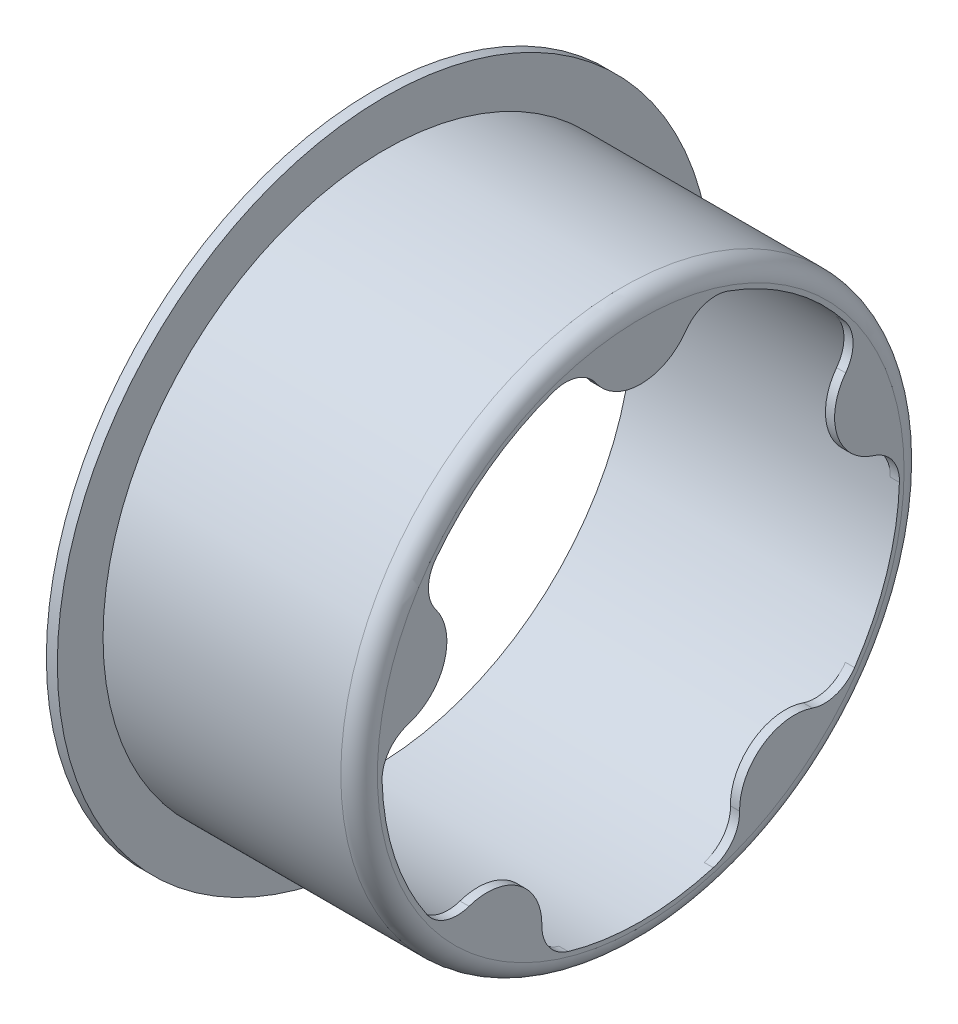
ISO-10303-21;
HEADER;
FILE_DESCRIPTION(('STEP AP214'),'2;1');
FILE_NAME('part.step','',(''),(''),'','','');
FILE_SCHEMA(('AUTOMOTIVE_DESIGN { 1 0 10303 214 1 1 1 1 }'));
ENDSEC;
DATA;
#1=APPLICATION_CONTEXT('core data for automotive mechanical design processes');
#2=APPLICATION_PROTOCOL_DEFINITION('international standard','automotive_design',2000,#1);
#3=PRODUCT_CONTEXT('',#1,'mechanical');
#4=PRODUCT('Part','Part','',(#3));
#5=PRODUCT_RELATED_PRODUCT_CATEGORY('part','',(#4));
#6=PRODUCT_DEFINITION_FORMATION('','',#4);
#7=PRODUCT_DEFINITION_CONTEXT('part definition',#1,'design');
#8=PRODUCT_DEFINITION('design','',#6,#7);
#9=PRODUCT_DEFINITION_SHAPE('','',#8);
#10=(LENGTH_UNIT() NAMED_UNIT(*) SI_UNIT(.MILLI.,.METRE.));
#11=(NAMED_UNIT(*) PLANE_ANGLE_UNIT() SI_UNIT($,.RADIAN.));
#12=(NAMED_UNIT(*) SI_UNIT($,.STERADIAN.) SOLID_ANGLE_UNIT());
#13=UNCERTAINTY_MEASURE_WITH_UNIT(LENGTH_MEASURE(1.E-05),#10,'distance_accuracy_value','');
#14=(GEOMETRIC_REPRESENTATION_CONTEXT(3) GLOBAL_UNCERTAINTY_ASSIGNED_CONTEXT((#13)) GLOBAL_UNIT_ASSIGNED_CONTEXT((#10,
#11,#12)) REPRESENTATION_CONTEXT('',''));
#15=CARTESIAN_POINT('',(0.,0.,0.));
#16=DIRECTION('',(0.,0.,1.));
#17=DIRECTION('',(1.,0.,0.));
#18=AXIS2_PLACEMENT_3D('',#15,#16,#17);
#19=CARTESIAN_POINT('',(-68.5530574043261,0.,0.));
#20=DIRECTION('',(-1.,0.,0.));
#21=DIRECTION('',(0.,0.,1.));
#22=AXIS2_PLACEMENT_3D('',#19,#20,#21);
#23=CYLINDRICAL_SURFACE('',#22,14.15);
#24=CARTESIAN_POINT('',(6.50000000000001,0.,0.));
#25=DIRECTION('',(1.,0.,0.));
#26=DIRECTION('',(0.,0.,-1.));
#27=AXIS2_PLACEMENT_3D('',#24,#25,#26);
#28=CIRCLE('',#27,14.15);
#29=CARTESIAN_POINT('',(6.50000000000001,8.65684248346348,-11.1929253645551));
#30=VERTEX_POINT('',#29);
#31=CARTESIAN_POINT('',(6.50000000000001,-0.424496227453108,-14.1436311798943));
#32=VERTEX_POINT('',#31);
#33=EDGE_CURVE('E376',#30,#32,#28,.F.);
#34=ORIENTED_EDGE('',*,*,#33,.F.);
#35=DIRECTION('',(-1.,0.,0.));
#36=VECTOR('',#35,1.);
#37=CARTESIAN_POINT('',(-68.5530574043261,8.65684248346348,-11.1929253645551));
#38=LINE('',#37,#36);
#39=CARTESIAN_POINT('',(7.00000000000001,8.65684248346348,-11.1929253645551));
#40=VERTEX_POINT('',#39);
#41=EDGE_CURVE('E222',#30,#40,#38,.F.);
#42=ORIENTED_EDGE('',*,*,#41,.T.);
#43=CARTESIAN_POINT('',(7.00000000000001,0.,0.));
#44=DIRECTION('',(1.,0.,0.));
#45=DIRECTION('',(0.,0.,-1.));
#46=AXIS2_PLACEMENT_3D('',#43,#44,#45);
#47=CIRCLE('',#46,14.15);
#48=CARTESIAN_POINT('',(7.00000000000001,13.3202160493827,-4.77434230002072));
#49=VERTEX_POINT('',#48);
#50=EDGE_CURVE('E195',#49,#40,#47,.F.);
#51=ORIENTED_EDGE('',*,*,#50,.F.);
#52=DIRECTION('',(-1.,0.,0.));
#53=VECTOR('',#52,1.);
#54=CARTESIAN_POINT('',(-68.5530574043261,13.3202160493827,-4.77434230002072));
#55=LINE('',#54,#53);
#56=CARTESIAN_POINT('',(6.50000000000001,13.3202160493827,-4.77434230002072));
#57=VERTEX_POINT('',#56);
#58=EDGE_CURVE('E199',#49,#57,#55,.T.);
#59=ORIENTED_EDGE('',*,*,#58,.T.);
#60=CARTESIAN_POINT('',(6.50000000000001,0.,0.));
#61=DIRECTION('',(1.,0.,0.));
#62=DIRECTION('',(0.,0.,-1.));
#63=AXIS2_PLACEMENT_3D('',#60,#61,#62);
#64=CIRCLE('',#63,14.15);
#65=CARTESIAN_POINT('',(6.50000000000001,13.3202160493827,4.77434230002072));
#66=VERTEX_POINT('',#65);
#67=EDGE_CURVE('E374',#66,#57,#64,.F.);
#68=ORIENTED_EDGE('',*,*,#67,.F.);
#69=DIRECTION('',(-1.,0.,0.));
#70=VECTOR('',#69,1.);
#71=CARTESIAN_POINT('',(-68.5530574043261,13.3202160493827,4.77434230002072));
#72=LINE('',#71,#70);
#73=CARTESIAN_POINT('',(7.00000000000001,13.3202160493827,4.77434230002072));
#74=VERTEX_POINT('',#73);
#75=EDGE_CURVE('E191',#66,#74,#72,.F.);
#76=ORIENTED_EDGE('',*,*,#75,.T.);
#77=CARTESIAN_POINT('',(7.00000000000001,8.65684248346347,11.1929253645551));
#78=VERTEX_POINT('',#77);
#79=EDGE_CURVE('E177',#78,#74,#47,.F.);
#80=ORIENTED_EDGE('',*,*,#79,.F.);
#81=DIRECTION('',(-1.,0.,0.));
#82=VECTOR('',#81,1.);
#83=CARTESIAN_POINT('',(-68.5530574043261,8.65684248346348,11.1929253645551));
#84=LINE('',#83,#82);
#85=CARTESIAN_POINT('',(6.50000000000001,8.65684248346347,11.1929253645551));
#86=VERTEX_POINT('',#85);
#87=EDGE_CURVE('E189',#78,#86,#84,.T.);
#88=ORIENTED_EDGE('',*,*,#87,.T.);
#89=CARTESIAN_POINT('',(6.50000000000001,0.,0.));
#90=DIRECTION('',(1.,0.,0.));
#91=DIRECTION('',(0.,0.,-1.));
#92=AXIS2_PLACEMENT_3D('',#89,#90,#91);
#93=CIRCLE('',#92,14.15);
#94=CARTESIAN_POINT('',(6.50000000000001,-0.424496227453111,14.1436311798943));
#95=VERTEX_POINT('',#94);
#96=EDGE_CURVE('E382',#95,#86,#93,.F.);
#97=ORIENTED_EDGE('',*,*,#96,.F.);
#98=DIRECTION('',(-1.,0.,0.));
#99=VECTOR('',#98,1.);
#100=CARTESIAN_POINT('',(-68.5530574043261,-0.424496227453111,14.1436311798943));
#101=LINE('',#100,#99);
#102=CARTESIAN_POINT('',(7.00000000000001,-0.424496227453111,14.1436311798943));
#103=VERTEX_POINT('',#102);
#104=EDGE_CURVE('E198',#95,#103,#101,.F.);
#105=ORIENTED_EDGE('',*,*,#104,.T.);
#106=CARTESIAN_POINT('',(7.00000000000001,-7.96999315934824,11.6919506088566));
#107=VERTEX_POINT('',#106);
#108=EDGE_CURVE('E192',#107,#103,#47,.F.);
#109=ORIENTED_EDGE('',*,*,#108,.F.);
#110=DIRECTION('',(-1.,0.,0.));
#111=VECTOR('',#110,1.);
#112=CARTESIAN_POINT('',(-68.5530574043261,-7.96999315934824,11.6919506088566));
#113=LINE('',#112,#111);
#114=CARTESIAN_POINT('',(6.50000000000001,-7.96999315934824,11.6919506088566));
#115=VERTEX_POINT('',#114);
#116=EDGE_CURVE('E210',#107,#115,#113,.T.);
#117=ORIENTED_EDGE('',*,*,#116,.T.);
#118=CARTESIAN_POINT('',(6.50000000000001,0.,0.));
#119=DIRECTION('',(1.,0.,0.));
#120=DIRECTION('',(0.,0.,-1.));
#121=AXIS2_PLACEMENT_3D('',#118,#119,#120);
#122=CIRCLE('',#121,14.15);
#123=CARTESIAN_POINT('',(6.50000000000001,-13.5825691460448,3.96690249349674));
#124=VERTEX_POINT('',#123);
#125=EDGE_CURVE('E380',#124,#115,#122,.F.);
#126=ORIENTED_EDGE('',*,*,#125,.F.);
#127=DIRECTION('',(-1.,0.,0.));
#128=VECTOR('',#127,1.);
#129=CARTESIAN_POINT('',(-68.5530574043261,-13.5825691460448,3.96690249349674));
#130=LINE('',#129,#128);
#131=CARTESIAN_POINT('',(7.00000000000001,-13.5825691460448,3.96690249349674));
#132=VERTEX_POINT('',#131);
#133=EDGE_CURVE('E202',#124,#132,#130,.F.);
#134=ORIENTED_EDGE('',*,*,#133,.T.);
#135=CARTESIAN_POINT('',(7.00000000000001,-13.5825691460448,-3.96690249349674));
#136=VERTEX_POINT('',#135);
#137=EDGE_CURVE('E369',#136,#132,#47,.F.);
#138=ORIENTED_EDGE('',*,*,#137,.F.);
#139=DIRECTION('',(-1.,0.,0.));
#140=VECTOR('',#139,1.);
#141=CARTESIAN_POINT('',(-68.5530574043261,-13.5825691460448,-3.96690249349674));
#142=LINE('',#141,#140);
#143=CARTESIAN_POINT('',(6.50000000000001,-13.5825691460448,-3.96690249349674));
#144=VERTEX_POINT('',#143);
#145=EDGE_CURVE('E213',#136,#144,#142,.T.);
#146=ORIENTED_EDGE('',*,*,#145,.T.);
#147=CARTESIAN_POINT('',(6.50000000000001,0.,0.));
#148=DIRECTION('',(1.,0.,0.));
#149=DIRECTION('',(0.,0.,-1.));
#150=AXIS2_PLACEMENT_3D('',#147,#148,#149);
#151=CIRCLE('',#150,14.15);
#152=CARTESIAN_POINT('',(6.50000000000001,-7.96999315934824,-11.6919506088566));
#153=VERTEX_POINT('',#152);
#154=EDGE_CURVE('E378',#153,#144,#151,.F.);
#155=ORIENTED_EDGE('',*,*,#154,.F.);
#156=DIRECTION('',(-1.,0.,0.));
#157=VECTOR('',#156,1.);
#158=CARTESIAN_POINT('',(-68.5530574043261,-7.96999315934824,-11.6919506088566));
#159=LINE('',#158,#157);
#160=CARTESIAN_POINT('',(7.00000000000001,-7.96999315934824,-11.6919506088566));
#161=VERTEX_POINT('',#160);
#162=EDGE_CURVE('E216',#153,#161,#159,.F.);
#163=ORIENTED_EDGE('',*,*,#162,.T.);
#164=CARTESIAN_POINT('',(7.00000000000001,-0.424496227453108,-14.1436311798943));
#165=VERTEX_POINT('',#164);
#166=EDGE_CURVE('E364',#165,#161,#47,.F.);
#167=ORIENTED_EDGE('',*,*,#166,.F.);
#168=DIRECTION('',(-1.,0.,0.));
#169=VECTOR('',#168,1.);
#170=CARTESIAN_POINT('',(-68.5530574043261,-0.424496227453108,-14.1436311798943));
#171=LINE('',#170,#169);
#172=EDGE_CURVE('E219',#165,#32,#171,.T.);
#173=ORIENTED_EDGE('',*,*,#172,.T.);
#174=EDGE_LOOP('',(#34,#42,#51,#59,#68,#76,#80,#88,#97,#105,#109,#117,#126,#134,#138,#146,#155,
#163,#167,#173));
#175=FACE_BOUND('',#174,.T.);
#176=CARTESIAN_POINT('',(-7.6,0.,0.));
#177=DIRECTION('',(-1.,0.,0.));
#178=DIRECTION('',(0.,0.,1.));
#179=AXIS2_PLACEMENT_3D('',#176,#177,#178);
#180=CIRCLE('',#179,14.15);
#181=CARTESIAN_POINT('',(-7.6,0.,14.15));
#182=VERTEX_POINT('',#181);
#183=EDGE_CURVE('E363',#182,#182,#180,.T.);
#184=ORIENTED_EDGE('',*,*,#183,.T.);
#185=EDGE_LOOP('',(#184));
#186=FACE_BOUND('',#185,.T.);
#187=ADVANCED_FACE('F34',(#175,#186),#23,.F.);
#188=CARTESIAN_POINT('',(-68.5530574043261,0.,0.));
#189=DIRECTION('',(-1.,0.,0.));
#190=DIRECTION('',(0.,0.,1.));
#191=AXIS2_PLACEMENT_3D('',#188,#189,#190);
#192=CYLINDRICAL_SURFACE('',#191,15.4);
#193=CARTESIAN_POINT('',(6.00000000000001,0.,0.));
#194=DIRECTION('',(1.,0.,0.));
#195=DIRECTION('',(0.,0.,-1.));
#196=AXIS2_PLACEMENT_3D('',#193,#194,#195);
#197=CIRCLE('',#196,15.4);
#198=CARTESIAN_POINT('',(6.00000000000001,0.,-15.4));
#199=VERTEX_POINT('',#198);
#200=EDGE_CURVE('E11',#199,#199,#197,.F.);
#201=ORIENTED_EDGE('',*,*,#200,.T.);
#202=EDGE_LOOP('',(#201));
#203=FACE_BOUND('',#202,.T.);
#204=CARTESIAN_POINT('',(-6.99999999999999,0.,0.));
#205=DIRECTION('',(-1.,0.,0.));
#206=DIRECTION('',(0.,0.,1.));
#207=AXIS2_PLACEMENT_3D('',#204,#205,#206);
#208=CIRCLE('',#207,15.4);
#209=CARTESIAN_POINT('',(-6.99999999999999,0.,15.4));
#210=VERTEX_POINT('',#209);
#211=EDGE_CURVE('E372',#210,#210,#208,.T.);
#212=ORIENTED_EDGE('',*,*,#211,.F.);
#213=EDGE_LOOP('',(#212));
#214=FACE_BOUND('',#213,.T.);
#215=ADVANCED_FACE('F298',(#203,#214),#192,.T.);
#216=CARTESIAN_POINT('',(-7.,0.,-17.9));
#217=DIRECTION('',(-1.,0.,0.));
#218=DIRECTION('',(0.,0.,1.));
#219=AXIS2_PLACEMENT_3D('',#216,#217,#218);
#220=PLANE('',#219);
#221=CARTESIAN_POINT('',(-6.99999999999999,0.,0.));
#222=DIRECTION('',(-1.,0.,0.));
#223=DIRECTION('',(0.,0.,1.));
#224=AXIS2_PLACEMENT_3D('',#221,#222,#223);
#225=CIRCLE('',#224,17.9);
#226=CARTESIAN_POINT('',(-6.99999999999999,0.,17.9));
#227=VERTEX_POINT('',#226);
#228=EDGE_CURVE('E429',#227,#227,#225,.T.);
#229=ORIENTED_EDGE('',*,*,#228,.F.);
#230=EDGE_LOOP('',(#229));
#231=FACE_BOUND('',#230,.T.);
#232=ORIENTED_EDGE('',*,*,#211,.T.);
#233=EDGE_LOOP('',(#232));
#234=FACE_BOUND('',#233,.T.);
#235=ADVANCED_FACE('F303',(#231,#234),#220,.F.);
#236=CARTESIAN_POINT('',(-68.5530574043261,0.,0.));
#237=DIRECTION('',(-1.,0.,0.));
#238=DIRECTION('',(0.,0.,1.));
#239=AXIS2_PLACEMENT_3D('',#236,#237,#238);
#240=CYLINDRICAL_SURFACE('',#239,17.9);
#241=CARTESIAN_POINT('',(-7.6,0.,0.));
#242=DIRECTION('',(-1.,0.,0.));
#243=DIRECTION('',(0.,0.,1.));
#244=AXIS2_PLACEMENT_3D('',#241,#242,#243);
#245=CIRCLE('',#244,17.9);
#246=CARTESIAN_POINT('',(-7.6,0.,17.9));
#247=VERTEX_POINT('',#246);
#248=EDGE_CURVE('E366',#247,#247,#245,.T.);
#249=ORIENTED_EDGE('',*,*,#248,.F.);
#250=EDGE_LOOP('',(#249));
#251=FACE_BOUND('',#250,.T.);
#252=ORIENTED_EDGE('',*,*,#228,.T.);
#253=EDGE_LOOP('',(#252));
#254=FACE_BOUND('',#253,.T.);
#255=ADVANCED_FACE('F312',(#251,#254),#240,.T.);
#256=CARTESIAN_POINT('',(-7.6,0.,-14.15));
#257=DIRECTION('',(1.,0.,0.));
#258=DIRECTION('',(0.,0.,-1.));
#259=AXIS2_PLACEMENT_3D('',#256,#257,#258);
#260=PLANE('',#259);
#261=ORIENTED_EDGE('',*,*,#183,.F.);
#262=EDGE_LOOP('',(#261));
#263=FACE_BOUND('',#262,.T.);
#264=ORIENTED_EDGE('',*,*,#248,.T.);
#265=EDGE_LOOP('',(#264));
#266=FACE_BOUND('',#265,.T.);
#267=ADVANCED_FACE('F309',(#263,#266),#260,.F.);
#268=CARTESIAN_POINT('',(7.00000000000001,0.,-17.9));
#269=DIRECTION('',(1.,0.,0.));
#270=DIRECTION('',(0.,0.,-1.));
#271=AXIS2_PLACEMENT_3D('',#268,#269,#270);
#272=PLANE('',#271);
#273=CARTESIAN_POINT('',(7.00000000000001,0.,0.));
#274=DIRECTION('',(1.,0.,0.));
#275=DIRECTION('',(0.,0.,-1.));
#276=AXIS2_PLACEMENT_3D('',#273,#274,#275);
#277=CIRCLE('',#276,14.4);
#278=CARTESIAN_POINT('',(7.00000000000001,0.,-14.4));
#279=VERTEX_POINT('',#278);
#280=EDGE_CURVE('E42',#279,#279,#277,.T.);
#281=ORIENTED_EDGE('',*,*,#280,.T.);
#282=EDGE_LOOP('',(#281));
#283=FACE_BOUND('',#282,.T.);
#284=CARTESIAN_POINT('',(7.00000000000001,-11.5689430195618,8.40532910778237));
#285=DIRECTION('',(1.,0.,0.));
#286=DIRECTION('',(0.,0.,-1.));
#287=AXIS2_PLACEMENT_3D('',#284,#285,#286);
#288=CIRCLE('',#287,3.);
#289=CARTESIAN_POINT('',(7.00000000000001,-11.6252400399566,5.40585738004519));
#290=VERTEX_POINT('',#289);
#291=CARTESIAN_POINT('',(7.00000000000001,-8.73367262348892,9.3857584938949));
#292=VERTEX_POINT('',#291);
#293=EDGE_CURVE('E421',#290,#292,#288,.T.);
#294=ORIENTED_EDGE('',*,*,#293,.T.);
#295=CARTESIAN_POINT('',(7.00000000000001,-6.84349235944036,10.0393780846366));
#296=DIRECTION('',(1.,0.,0.));
#297=DIRECTION('',(0.,0.,-1.));
#298=AXIS2_PLACEMENT_3D('',#295,#296,#297);
#299=CIRCLE('',#298,2.);
#300=EDGE_CURVE('E264',#292,#107,#299,.F.);
#301=ORIENTED_EDGE('',*,*,#300,.T.);
#302=ORIENTED_EDGE('',*,*,#108,.T.);
#303=CARTESIAN_POINT('',(7.00000000000001,-0.364496760675286,12.1445313664817));
#304=DIRECTION('',(1.,0.,0.));
#305=DIRECTION('',(0.,0.,-1.));
#306=AXIS2_PLACEMENT_3D('',#303,#304,#305);
#307=CIRCLE('',#306,2.);
#308=CARTESIAN_POINT('',(7.00000000000001,1.54887915141953,12.7267620930973));
#309=VERTEX_POINT('',#308);
#310=EDGE_CURVE('E271',#103,#309,#307,.F.);
#311=ORIENTED_EDGE('',*,*,#310,.T.);
#312=CARTESIAN_POINT('',(7.00000000000001,4.41894301956175,13.6001081830207));
#313=DIRECTION('',(1.,0.,0.));
#314=DIRECTION('',(0.,0.,-1.));
#315=AXIS2_PLACEMENT_3D('',#312,#313,#314);
#316=CIRCLE('',#315,3.);
#317=CARTESIAN_POINT('',(7.00000000000001,6.22753351202602,11.2065751394703));
#318=VERTEX_POINT('',#317);
#319=EDGE_CURVE('E179',#309,#318,#316,.T.);
#320=ORIENTED_EDGE('',*,*,#319,.T.);
#321=CARTESIAN_POINT('',(7.00000000000001,7.43326050700221,9.61088644376997));
#322=DIRECTION('',(1.,0.,0.));
#323=DIRECTION('',(0.,0.,-1.));
#324=AXIS2_PLACEMENT_3D('',#321,#322,#323);
#325=CIRCLE('',#324,2.);
#326=EDGE_CURVE('E173',#318,#78,#325,.F.);
#327=ORIENTED_EDGE('',*,*,#326,.T.);
#328=ORIENTED_EDGE('',*,*,#79,.T.);
#329=CARTESIAN_POINT('',(7.00000000000001,11.4375,4.09952360037115));
#330=DIRECTION('',(1.,0.,0.));
#331=DIRECTION('',(0.,0.,-1.));
#332=AXIS2_PLACEMENT_3D('',#329,#330,#331);
#333=CIRCLE('',#332,2.);
#334=CARTESIAN_POINT('',(7.00000000000001,12.5825,2.45971416022269));
#335=VERTEX_POINT('',#334);
#336=EDGE_CURVE('E280',#74,#335,#333,.F.);
#337=ORIENTED_EDGE('',*,*,#336,.T.);
#338=CARTESIAN_POINT('',(7.00000000000001,14.3,0.));
#339=DIRECTION('',(1.,0.,0.));
#340=DIRECTION('',(0.,0.,-1.));
#341=AXIS2_PLACEMENT_3D('',#338,#339,#340);
#342=CIRCLE('',#341,3.);
#343=CARTESIAN_POINT('',(7.00000000000001,12.5825,-2.45971416022269));
#344=VERTEX_POINT('',#343);
#345=EDGE_CURVE('E361',#335,#344,#342,.T.);
#346=ORIENTED_EDGE('',*,*,#345,.T.);
#347=CARTESIAN_POINT('',(7.00000000000001,11.4375,-4.09952360037115));
#348=DIRECTION('',(1.,0.,0.));
#349=DIRECTION('',(0.,0.,-1.));
#350=AXIS2_PLACEMENT_3D('',#347,#348,#349);
#351=CIRCLE('',#350,2.);
#352=EDGE_CURVE('E278',#344,#49,#351,.F.);
#353=ORIENTED_EDGE('',*,*,#352,.T.);
#354=ORIENTED_EDGE('',*,*,#50,.T.);
#355=CARTESIAN_POINT('',(7.00000000000001,7.43326050700221,-9.61088644376997));
#356=DIRECTION('',(1.,0.,0.));
#357=DIRECTION('',(0.,0.,-1.));
#358=AXIS2_PLACEMENT_3D('',#355,#356,#357);
#359=CIRCLE('',#358,2.);
#360=CARTESIAN_POINT('',(7.00000000000001,6.22753351202603,-11.2065751394703));
#361=VERTEX_POINT('',#360);
#362=EDGE_CURVE('E244',#40,#361,#359,.F.);
#363=ORIENTED_EDGE('',*,*,#362,.T.);
#364=CARTESIAN_POINT('',(7.00000000000001,4.41894301956175,-13.6001081830207));
#365=DIRECTION('',(1.,0.,0.));
#366=DIRECTION('',(0.,0.,-1.));
#367=AXIS2_PLACEMENT_3D('',#364,#365,#366);
#368=CIRCLE('',#367,3.);
#369=CARTESIAN_POINT('',(7.00000000000001,1.54887915141953,-12.7267620930973));
#370=VERTEX_POINT('',#369);
#371=EDGE_CURVE('E412',#361,#370,#368,.T.);
#372=ORIENTED_EDGE('',*,*,#371,.T.);
#373=CARTESIAN_POINT('',(7.00000000000001,-0.364496760675283,-12.1445313664817));
#374=DIRECTION('',(1.,0.,0.));
#375=DIRECTION('',(0.,0.,-1.));
#376=AXIS2_PLACEMENT_3D('',#373,#374,#375);
#377=CIRCLE('',#376,2.);
#378=EDGE_CURVE('E251',#370,#165,#377,.F.);
#379=ORIENTED_EDGE('',*,*,#378,.T.);
#380=ORIENTED_EDGE('',*,*,#166,.T.);
#381=CARTESIAN_POINT('',(7.00000000000001,-6.84349235944036,-10.0393780846366));
#382=DIRECTION('',(1.,0.,0.));
#383=DIRECTION('',(0.,0.,-1.));
#384=AXIS2_PLACEMENT_3D('',#381,#382,#383);
#385=CIRCLE('',#384,2.);
#386=CARTESIAN_POINT('',(7.00000000000001,-8.73367262348891,-9.3857584938949));
#387=VERTEX_POINT('',#386);
#388=EDGE_CURVE('E253',#161,#387,#385,.F.);
#389=ORIENTED_EDGE('',*,*,#388,.T.);
#390=CARTESIAN_POINT('',(7.00000000000001,-11.5689430195617,-8.40532910778237));
#391=DIRECTION('',(1.,0.,0.));
#392=DIRECTION('',(0.,0.,-1.));
#393=AXIS2_PLACEMENT_3D('',#390,#391,#392);
#394=CIRCLE('',#393,3.);
#395=CARTESIAN_POINT('',(7.00000000000001,-11.6252400399566,-5.40585738004519));
#396=VERTEX_POINT('',#395);
#397=EDGE_CURVE('E413',#387,#396,#394,.T.);
#398=ORIENTED_EDGE('',*,*,#397,.T.);
#399=CARTESIAN_POINT('',(7.00000000000001,-11.6627713868866,-3.40620956155374));
#400=DIRECTION('',(1.,0.,0.));
#401=DIRECTION('',(0.,0.,-1.));
#402=AXIS2_PLACEMENT_3D('',#399,#400,#401);
#403=CIRCLE('',#402,2.);
#404=EDGE_CURVE('E260',#396,#136,#403,.F.);
#405=ORIENTED_EDGE('',*,*,#404,.T.);
#406=ORIENTED_EDGE('',*,*,#137,.T.);
#407=CARTESIAN_POINT('',(7.00000000000001,-11.6627713868866,3.40620956155373));
#408=DIRECTION('',(1.,0.,0.));
#409=DIRECTION('',(0.,0.,-1.));
#410=AXIS2_PLACEMENT_3D('',#407,#408,#409);
#411=CIRCLE('',#410,2.);
#412=EDGE_CURVE('E266',#132,#290,#411,.F.);
#413=ORIENTED_EDGE('',*,*,#412,.T.);
#414=EDGE_LOOP('',(#294,#301,#302,#311,#320,#327,#328,#337,#346,#353,#354,#363,#372,#379,#380,
#389,#398,#405,#406,#413));
#415=FACE_BOUND('',#414,.T.);
#416=ADVANCED_FACE('F176',(#283,#415),#272,.T.);
#417=CARTESIAN_POINT('',(6.50000000000001,7.15,0.));
#418=DIRECTION('',(1.,0.,0.));
#419=DIRECTION('',(0.,0.,-1.));
#420=AXIS2_PLACEMENT_3D('',#417,#418,#419);
#421=PLANE('',#420);
#422=CARTESIAN_POINT('',(6.50000000000001,14.3,0.));
#423=DIRECTION('',(1.,0.,0.));
#424=DIRECTION('',(0.,0.,-1.));
#425=AXIS2_PLACEMENT_3D('',#422,#423,#424);
#426=CIRCLE('',#425,3.);
#427=CARTESIAN_POINT('',(6.50000000000001,12.5825,2.45971416022269));
#428=VERTEX_POINT('',#427);
#429=CARTESIAN_POINT('',(6.50000000000001,12.5825,-2.45971416022269));
#430=VERTEX_POINT('',#429);
#431=EDGE_CURVE('E193',#428,#430,#426,.T.);
#432=ORIENTED_EDGE('',*,*,#431,.F.);
#433=CARTESIAN_POINT('',(6.50000000000001,11.4375,4.09952360037115));
#434=DIRECTION('',(1.,0.,0.));
#435=DIRECTION('',(0.,0.,-1.));
#436=AXIS2_PLACEMENT_3D('',#433,#434,#435);
#437=CIRCLE('',#436,2.);
#438=EDGE_CURVE('E282',#428,#66,#437,.T.);
#439=ORIENTED_EDGE('',*,*,#438,.T.);
#440=ORIENTED_EDGE('',*,*,#67,.T.);
#441=CARTESIAN_POINT('',(6.50000000000001,11.4375,-4.09952360037115));
#442=DIRECTION('',(1.,0.,0.));
#443=DIRECTION('',(0.,0.,-1.));
#444=AXIS2_PLACEMENT_3D('',#441,#442,#443);
#445=CIRCLE('',#444,2.);
#446=EDGE_CURVE('E49',#57,#430,#445,.T.);
#447=ORIENTED_EDGE('',*,*,#446,.T.);
#448=EDGE_LOOP('',(#432,#439,#440,#447));
#449=FACE_BOUND('',#448,.T.);
#450=ADVANCED_FACE('F441',(#449),#421,.F.);
#451=CARTESIAN_POINT('',(6.50000000000001,14.3,0.));
#452=DIRECTION('',(1.,0.,0.));
#453=DIRECTION('',(0.,0.,-1.));
#454=AXIS2_PLACEMENT_3D('',#451,#452,#453);
#455=CYLINDRICAL_SURFACE('',#454,3.);
#456=ORIENTED_EDGE('',*,*,#431,.T.);
#457=DIRECTION('',(1.,0.,0.));
#458=VECTOR('',#457,1.);
#459=CARTESIAN_POINT('',(6.50000000000001,12.5825,-2.45971416022269));
#460=LINE('',#459,#458);
#461=EDGE_CURVE('E242',#430,#344,#460,.T.);
#462=ORIENTED_EDGE('',*,*,#461,.T.);
#463=ORIENTED_EDGE('',*,*,#345,.F.);
#464=DIRECTION('',(1.,0.,0.));
#465=VECTOR('',#464,1.);
#466=CARTESIAN_POINT('',(6.50000000000001,12.5825,2.45971416022269));
#467=LINE('',#466,#465);
#468=EDGE_CURVE('E56',#335,#428,#467,.F.);
#469=ORIENTED_EDGE('',*,*,#468,.T.);
#470=EDGE_LOOP('',(#456,#462,#463,#469));
#471=FACE_BOUND('',#470,.T.);
#472=ADVANCED_FACE('F439',(#471),#455,.T.);
#473=CARTESIAN_POINT('',(6.50000000000001,2.20947150978088,-6.80005409151035));
#474=DIRECTION('',(1.,0.,0.));
#475=DIRECTION('',(0.,0.,-1.));
#476=AXIS2_PLACEMENT_3D('',#473,#474,#475);
#477=PLANE('',#476);
#478=CARTESIAN_POINT('',(6.50000000000001,4.41894301956175,-13.6001081830207));
#479=DIRECTION('',(1.,0.,0.));
#480=DIRECTION('',(0.,0.,-1.));
#481=AXIS2_PLACEMENT_3D('',#478,#479,#480);
#482=CIRCLE('',#481,3.);
#483=CARTESIAN_POINT('',(6.50000000000001,6.22753351202603,-11.2065751394703));
#484=VERTEX_POINT('',#483);
#485=CARTESIAN_POINT('',(6.50000000000001,1.54887915141953,-12.7267620930973));
#486=VERTEX_POINT('',#485);
#487=EDGE_CURVE('E416',#484,#486,#482,.T.);
#488=ORIENTED_EDGE('',*,*,#487,.F.);
#489=CARTESIAN_POINT('',(6.50000000000001,7.43326050700221,-9.61088644376997));
#490=DIRECTION('',(1.,0.,0.));
#491=DIRECTION('',(0.,0.,-1.));
#492=AXIS2_PLACEMENT_3D('',#489,#490,#491);
#493=CIRCLE('',#492,2.);
#494=EDGE_CURVE('E246',#484,#30,#493,.T.);
#495=ORIENTED_EDGE('',*,*,#494,.T.);
#496=ORIENTED_EDGE('',*,*,#33,.T.);
#497=CARTESIAN_POINT('',(6.50000000000001,-0.364496760675283,-12.1445313664817));
#498=DIRECTION('',(1.,0.,0.));
#499=DIRECTION('',(0.,0.,-1.));
#500=AXIS2_PLACEMENT_3D('',#497,#498,#499);
#501=CIRCLE('',#500,2.);
#502=EDGE_CURVE('E249',#32,#486,#501,.T.);
#503=ORIENTED_EDGE('',*,*,#502,.T.);
#504=EDGE_LOOP('',(#488,#495,#496,#503));
#505=FACE_BOUND('',#504,.T.);
#506=ADVANCED_FACE('F448',(#505),#477,.F.);
#507=CARTESIAN_POINT('',(6.50000000000001,4.41894301956175,-13.6001081830207));
#508=DIRECTION('',(1.,0.,0.));
#509=DIRECTION('',(0.,0.,-1.));
#510=AXIS2_PLACEMENT_3D('',#507,#508,#509);
#511=CYLINDRICAL_SURFACE('',#510,3.);
#512=ORIENTED_EDGE('',*,*,#371,.F.);
#513=DIRECTION('',(1.,0.,0.));
#514=VECTOR('',#513,1.);
#515=CARTESIAN_POINT('',(6.50000000000001,6.22753351202603,-11.2065751394703));
#516=LINE('',#515,#514);
#517=EDGE_CURVE('E227',#361,#484,#516,.F.);
#518=ORIENTED_EDGE('',*,*,#517,.T.);
#519=ORIENTED_EDGE('',*,*,#487,.T.);
#520=DIRECTION('',(1.,0.,0.));
#521=VECTOR('',#520,1.);
#522=CARTESIAN_POINT('',(6.50000000000001,1.54887915141953,-12.7267620930973));
#523=LINE('',#522,#521);
#524=EDGE_CURVE('E225',#486,#370,#523,.T.);
#525=ORIENTED_EDGE('',*,*,#524,.T.);
#526=EDGE_LOOP('',(#512,#518,#519,#525));
#527=FACE_BOUND('',#526,.T.);
#528=ADVANCED_FACE('F450',(#527),#511,.T.);
#529=CARTESIAN_POINT('',(6.50000000000001,-5.78447150978087,-4.20266455389118));
#530=DIRECTION('',(1.,0.,0.));
#531=DIRECTION('',(0.,0.,-1.));
#532=AXIS2_PLACEMENT_3D('',#529,#530,#531);
#533=PLANE('',#532);
#534=CARTESIAN_POINT('',(6.50000000000001,-11.5689430195617,-8.40532910778237));
#535=DIRECTION('',(1.,0.,0.));
#536=DIRECTION('',(0.,0.,-1.));
#537=AXIS2_PLACEMENT_3D('',#534,#535,#536);
#538=CIRCLE('',#537,3.);
#539=CARTESIAN_POINT('',(6.50000000000001,-8.73367262348891,-9.3857584938949));
#540=VERTEX_POINT('',#539);
#541=CARTESIAN_POINT('',(6.50000000000001,-11.6252400399566,-5.40585738004519));
#542=VERTEX_POINT('',#541);
#543=EDGE_CURVE('E406',#540,#542,#538,.T.);
#544=ORIENTED_EDGE('',*,*,#543,.F.);
#545=CARTESIAN_POINT('',(6.50000000000001,-6.84349235944036,-10.0393780846366));
#546=DIRECTION('',(1.,0.,0.));
#547=DIRECTION('',(0.,0.,-1.));
#548=AXIS2_PLACEMENT_3D('',#545,#546,#547);
#549=CIRCLE('',#548,2.);
#550=EDGE_CURVE('E255',#540,#153,#549,.T.);
#551=ORIENTED_EDGE('',*,*,#550,.T.);
#552=ORIENTED_EDGE('',*,*,#154,.T.);
#553=CARTESIAN_POINT('',(6.50000000000001,-11.6627713868866,-3.40620956155374));
#554=DIRECTION('',(1.,0.,0.));
#555=DIRECTION('',(0.,0.,-1.));
#556=AXIS2_PLACEMENT_3D('',#553,#554,#555);
#557=CIRCLE('',#556,2.);
#558=EDGE_CURVE('E258',#144,#542,#557,.T.);
#559=ORIENTED_EDGE('',*,*,#558,.T.);
#560=EDGE_LOOP('',(#544,#551,#552,#559));
#561=FACE_BOUND('',#560,.T.);
#562=ADVANCED_FACE('F405',(#561),#533,.F.);
#563=CARTESIAN_POINT('',(6.50000000000001,-11.5689430195617,-8.40532910778237));
#564=DIRECTION('',(1.,0.,0.));
#565=DIRECTION('',(0.,0.,-1.));
#566=AXIS2_PLACEMENT_3D('',#563,#564,#565);
#567=CYLINDRICAL_SURFACE('',#566,3.);
#568=ORIENTED_EDGE('',*,*,#397,.F.);
#569=DIRECTION('',(1.,0.,0.));
#570=VECTOR('',#569,1.);
#571=CARTESIAN_POINT('',(6.50000000000001,-8.73367262348891,-9.3857584938949));
#572=LINE('',#571,#570);
#573=EDGE_CURVE('E231',#387,#540,#572,.F.);
#574=ORIENTED_EDGE('',*,*,#573,.T.);
#575=ORIENTED_EDGE('',*,*,#543,.T.);
#576=DIRECTION('',(1.,0.,0.));
#577=VECTOR('',#576,1.);
#578=CARTESIAN_POINT('',(6.50000000000001,-11.6252400399566,-5.40585738004519));
#579=LINE('',#578,#577);
#580=EDGE_CURVE('E229',#542,#396,#579,.T.);
#581=ORIENTED_EDGE('',*,*,#580,.T.);
#582=EDGE_LOOP('',(#568,#574,#575,#581));
#583=FACE_BOUND('',#582,.T.);
#584=ADVANCED_FACE('F410',(#583),#567,.T.);
#585=CARTESIAN_POINT('',(6.50000000000001,-5.78447150978088,4.20266455389118));
#586=DIRECTION('',(1.,0.,0.));
#587=DIRECTION('',(0.,0.,-1.));
#588=AXIS2_PLACEMENT_3D('',#585,#586,#587);
#589=PLANE('',#588);
#590=CARTESIAN_POINT('',(6.50000000000001,-11.5689430195618,8.40532910778237));
#591=DIRECTION('',(1.,0.,0.));
#592=DIRECTION('',(0.,0.,-1.));
#593=AXIS2_PLACEMENT_3D('',#590,#591,#592);
#594=CIRCLE('',#593,3.);
#595=CARTESIAN_POINT('',(6.50000000000001,-11.6252400399566,5.40585738004519));
#596=VERTEX_POINT('',#595);
#597=CARTESIAN_POINT('',(6.50000000000001,-8.73367262348892,9.3857584938949));
#598=VERTEX_POINT('',#597);
#599=EDGE_CURVE('E418',#596,#598,#594,.T.);
#600=ORIENTED_EDGE('',*,*,#599,.F.);
#601=CARTESIAN_POINT('',(6.50000000000001,-11.6627713868866,3.40620956155373));
#602=DIRECTION('',(1.,0.,0.));
#603=DIRECTION('',(0.,0.,-1.));
#604=AXIS2_PLACEMENT_3D('',#601,#602,#603);
#605=CIRCLE('',#604,2.);
#606=EDGE_CURVE('E268',#596,#124,#605,.T.);
#607=ORIENTED_EDGE('',*,*,#606,.T.);
#608=ORIENTED_EDGE('',*,*,#125,.T.);
#609=CARTESIAN_POINT('',(6.50000000000001,-6.84349235944036,10.0393780846366));
#610=DIRECTION('',(1.,0.,0.));
#611=DIRECTION('',(0.,0.,-1.));
#612=AXIS2_PLACEMENT_3D('',#609,#610,#611);
#613=CIRCLE('',#612,2.);
#614=EDGE_CURVE('E262',#115,#598,#613,.T.);
#615=ORIENTED_EDGE('',*,*,#614,.T.);
#616=EDGE_LOOP('',(#600,#607,#608,#615));
#617=FACE_BOUND('',#616,.T.);
#618=ADVANCED_FACE('F459',(#617),#589,.F.);
#619=CARTESIAN_POINT('',(6.50000000000001,-11.5689430195618,8.40532910778237));
#620=DIRECTION('',(1.,0.,0.));
#621=DIRECTION('',(0.,0.,-1.));
#622=AXIS2_PLACEMENT_3D('',#619,#620,#621);
#623=CYLINDRICAL_SURFACE('',#622,3.);
#624=ORIENTED_EDGE('',*,*,#599,.T.);
#625=DIRECTION('',(1.,0.,0.));
#626=VECTOR('',#625,1.);
#627=CARTESIAN_POINT('',(6.50000000000001,-8.73367262348892,9.3857584938949));
#628=LINE('',#627,#626);
#629=EDGE_CURVE('E235',#598,#292,#628,.T.);
#630=ORIENTED_EDGE('',*,*,#629,.T.);
#631=ORIENTED_EDGE('',*,*,#293,.F.);
#632=DIRECTION('',(1.,0.,0.));
#633=VECTOR('',#632,1.);
#634=CARTESIAN_POINT('',(6.50000000000001,-11.6252400399566,5.40585738004519));
#635=LINE('',#634,#633);
#636=EDGE_CURVE('E233',#290,#596,#635,.F.);
#637=ORIENTED_EDGE('',*,*,#636,.T.);
#638=EDGE_LOOP('',(#624,#630,#631,#637));
#639=FACE_BOUND('',#638,.T.);
#640=ADVANCED_FACE('F462',(#639),#623,.T.);
#641=CARTESIAN_POINT('',(6.50000000000001,2.20947150978087,6.80005409151035));
#642=DIRECTION('',(1.,0.,0.));
#643=DIRECTION('',(0.,0.,-1.));
#644=AXIS2_PLACEMENT_3D('',#641,#642,#643);
#645=PLANE('',#644);
#646=CARTESIAN_POINT('',(6.50000000000001,4.41894301956175,13.6001081830207));
#647=DIRECTION('',(1.,0.,0.));
#648=DIRECTION('',(0.,0.,-1.));
#649=AXIS2_PLACEMENT_3D('',#646,#647,#648);
#650=CIRCLE('',#649,3.);
#651=CARTESIAN_POINT('',(6.50000000000001,1.54887915141953,12.7267620930973));
#652=VERTEX_POINT('',#651);
#653=CARTESIAN_POINT('',(6.50000000000001,6.22753351202602,11.2065751394703));
#654=VERTEX_POINT('',#653);
#655=EDGE_CURVE('E643',#652,#654,#650,.T.);
#656=ORIENTED_EDGE('',*,*,#655,.F.);
#657=CARTESIAN_POINT('',(6.50000000000001,-0.364496760675286,12.1445313664817));
#658=DIRECTION('',(1.,0.,0.));
#659=DIRECTION('',(0.,0.,-1.));
#660=AXIS2_PLACEMENT_3D('',#657,#658,#659);
#661=CIRCLE('',#660,2.);
#662=EDGE_CURVE('E273',#652,#95,#661,.T.);
#663=ORIENTED_EDGE('',*,*,#662,.T.);
#664=ORIENTED_EDGE('',*,*,#96,.T.);
#665=CARTESIAN_POINT('',(6.50000000000001,7.43326050700221,9.61088644376997));
#666=DIRECTION('',(1.,0.,0.));
#667=DIRECTION('',(0.,0.,-1.));
#668=AXIS2_PLACEMENT_3D('',#665,#666,#667);
#669=CIRCLE('',#668,2.);
#670=EDGE_CURVE('E183',#86,#654,#669,.T.);
#671=ORIENTED_EDGE('',*,*,#670,.T.);
#672=EDGE_LOOP('',(#656,#663,#664,#671));
#673=FACE_BOUND('',#672,.T.);
#674=ADVANCED_FACE('F385',(#673),#645,.F.);
#675=CARTESIAN_POINT('',(6.50000000000001,4.41894301956175,13.6001081830207));
#676=DIRECTION('',(1.,0.,0.));
#677=DIRECTION('',(0.,0.,-1.));
#678=AXIS2_PLACEMENT_3D('',#675,#676,#677);
#679=CYLINDRICAL_SURFACE('',#678,3.);
#680=ORIENTED_EDGE('',*,*,#319,.F.);
#681=DIRECTION('',(1.,0.,0.));
#682=VECTOR('',#681,1.);
#683=CARTESIAN_POINT('',(6.50000000000001,1.54887915141953,12.7267620930973));
#684=LINE('',#683,#682);
#685=EDGE_CURVE('E239',#309,#652,#684,.F.);
#686=ORIENTED_EDGE('',*,*,#685,.T.);
#687=ORIENTED_EDGE('',*,*,#655,.T.);
#688=DIRECTION('',(1.,0.,0.));
#689=VECTOR('',#688,1.);
#690=CARTESIAN_POINT('',(6.50000000000001,6.22753351202602,11.2065751394703));
#691=LINE('',#690,#689);
#692=EDGE_CURVE('E237',#654,#318,#691,.T.);
#693=ORIENTED_EDGE('',*,*,#692,.T.);
#694=EDGE_LOOP('',(#680,#686,#687,#693));
#695=FACE_BOUND('',#694,.T.);
#696=ADVANCED_FACE('F324',(#695),#679,.T.);
#697=CARTESIAN_POINT('',(6.50000000000001,7.43326050700221,-9.61088644376997));
#698=DIRECTION('',(1.,0.,0.));
#699=DIRECTION('',(0.,0.,-1.));
#700=AXIS2_PLACEMENT_3D('',#697,#698,#699);
#701=CYLINDRICAL_SURFACE('',#700,2.);
#702=ORIENTED_EDGE('',*,*,#494,.F.);
#703=ORIENTED_EDGE('',*,*,#517,.F.);
#704=ORIENTED_EDGE('',*,*,#362,.F.);
#705=ORIENTED_EDGE('',*,*,#41,.F.);
#706=EDGE_LOOP('',(#702,#703,#704,#705));
#707=FACE_BOUND('',#706,.T.);
#708=ADVANCED_FACE('F320',(#707),#701,.F.);
#709=CARTESIAN_POINT('',(6.50000000000001,-0.364496760675283,-12.1445313664817));
#710=DIRECTION('',(-1.,0.,0.));
#711=DIRECTION('',(0.,0.,1.));
#712=AXIS2_PLACEMENT_3D('',#709,#710,#711);
#713=CYLINDRICAL_SURFACE('',#712,2.);
#714=ORIENTED_EDGE('',*,*,#378,.F.);
#715=ORIENTED_EDGE('',*,*,#524,.F.);
#716=ORIENTED_EDGE('',*,*,#502,.F.);
#717=ORIENTED_EDGE('',*,*,#172,.F.);
#718=EDGE_LOOP('',(#714,#715,#716,#717));
#719=FACE_BOUND('',#718,.T.);
#720=ADVANCED_FACE('F323',(#719),#713,.F.);
#721=CARTESIAN_POINT('',(6.50000000000001,-6.84349235944036,-10.0393780846366));
#722=DIRECTION('',(1.,0.,0.));
#723=DIRECTION('',(0.,0.,-1.));
#724=AXIS2_PLACEMENT_3D('',#721,#722,#723);
#725=CYLINDRICAL_SURFACE('',#724,2.);
#726=ORIENTED_EDGE('',*,*,#550,.F.);
#727=ORIENTED_EDGE('',*,*,#573,.F.);
#728=ORIENTED_EDGE('',*,*,#388,.F.);
#729=ORIENTED_EDGE('',*,*,#162,.F.);
#730=EDGE_LOOP('',(#726,#727,#728,#729));
#731=FACE_BOUND('',#730,.T.);
#732=ADVANCED_FACE('F328',(#731),#725,.F.);
#733=CARTESIAN_POINT('',(6.50000000000001,-11.6627713868866,-3.40620956155374));
#734=DIRECTION('',(-1.,0.,0.));
#735=DIRECTION('',(0.,0.,1.));
#736=AXIS2_PLACEMENT_3D('',#733,#734,#735);
#737=CYLINDRICAL_SURFACE('',#736,2.);
#738=ORIENTED_EDGE('',*,*,#404,.F.);
#739=ORIENTED_EDGE('',*,*,#580,.F.);
#740=ORIENTED_EDGE('',*,*,#558,.F.);
#741=ORIENTED_EDGE('',*,*,#145,.F.);
#742=EDGE_LOOP('',(#738,#739,#740,#741));
#743=FACE_BOUND('',#742,.T.);
#744=ADVANCED_FACE('F332',(#743),#737,.F.);
#745=CARTESIAN_POINT('',(6.50000000000001,-6.84349235944036,10.0393780846366));
#746=DIRECTION('',(-1.,0.,0.));
#747=DIRECTION('',(0.,0.,1.));
#748=AXIS2_PLACEMENT_3D('',#745,#746,#747);
#749=CYLINDRICAL_SURFACE('',#748,2.);
#750=ORIENTED_EDGE('',*,*,#300,.F.);
#751=ORIENTED_EDGE('',*,*,#629,.F.);
#752=ORIENTED_EDGE('',*,*,#614,.F.);
#753=ORIENTED_EDGE('',*,*,#116,.F.);
#754=EDGE_LOOP('',(#750,#751,#752,#753));
#755=FACE_BOUND('',#754,.T.);
#756=ADVANCED_FACE('F336',(#755),#749,.F.);
#757=CARTESIAN_POINT('',(6.50000000000001,-11.6627713868866,3.40620956155373));
#758=DIRECTION('',(1.,0.,0.));
#759=DIRECTION('',(0.,0.,-1.));
#760=AXIS2_PLACEMENT_3D('',#757,#758,#759);
#761=CYLINDRICAL_SURFACE('',#760,2.);
#762=ORIENTED_EDGE('',*,*,#606,.F.);
#763=ORIENTED_EDGE('',*,*,#636,.F.);
#764=ORIENTED_EDGE('',*,*,#412,.F.);
#765=ORIENTED_EDGE('',*,*,#133,.F.);
#766=EDGE_LOOP('',(#762,#763,#764,#765));
#767=FACE_BOUND('',#766,.T.);
#768=ADVANCED_FACE('F340',(#767),#761,.F.);
#769=CARTESIAN_POINT('',(6.50000000000001,-0.364496760675286,12.1445313664817));
#770=DIRECTION('',(1.,0.,0.));
#771=DIRECTION('',(0.,0.,-1.));
#772=AXIS2_PLACEMENT_3D('',#769,#770,#771);
#773=CYLINDRICAL_SURFACE('',#772,2.);
#774=ORIENTED_EDGE('',*,*,#662,.F.);
#775=ORIENTED_EDGE('',*,*,#685,.F.);
#776=ORIENTED_EDGE('',*,*,#310,.F.);
#777=ORIENTED_EDGE('',*,*,#104,.F.);
#778=EDGE_LOOP('',(#774,#775,#776,#777));
#779=FACE_BOUND('',#778,.T.);
#780=ADVANCED_FACE('F344',(#779),#773,.F.);
#781=CARTESIAN_POINT('',(6.50000000000001,7.43326050700221,9.61088644376997));
#782=DIRECTION('',(-1.,0.,0.));
#783=DIRECTION('',(0.,0.,1.));
#784=AXIS2_PLACEMENT_3D('',#781,#782,#783);
#785=CYLINDRICAL_SURFACE('',#784,2.);
#786=ORIENTED_EDGE('',*,*,#326,.F.);
#787=ORIENTED_EDGE('',*,*,#692,.F.);
#788=ORIENTED_EDGE('',*,*,#670,.F.);
#789=ORIENTED_EDGE('',*,*,#87,.F.);
#790=EDGE_LOOP('',(#786,#787,#788,#789));
#791=FACE_BOUND('',#790,.T.);
#792=ADVANCED_FACE('F197',(#791),#785,.F.);
#793=CARTESIAN_POINT('',(6.50000000000001,11.4375,-4.09952360037115));
#794=DIRECTION('',(-1.,0.,0.));
#795=DIRECTION('',(0.,0.,1.));
#796=AXIS2_PLACEMENT_3D('',#793,#794,#795);
#797=CYLINDRICAL_SURFACE('',#796,2.);
#798=ORIENTED_EDGE('',*,*,#352,.F.);
#799=ORIENTED_EDGE('',*,*,#461,.F.);
#800=ORIENTED_EDGE('',*,*,#446,.F.);
#801=ORIENTED_EDGE('',*,*,#58,.F.);
#802=EDGE_LOOP('',(#798,#799,#800,#801));
#803=FACE_BOUND('',#802,.T.);
#804=ADVANCED_FACE('F294',(#803),#797,.F.);
#805=CARTESIAN_POINT('',(6.50000000000001,11.4375,4.09952360037115));
#806=DIRECTION('',(1.,0.,0.));
#807=DIRECTION('',(0.,0.,-1.));
#808=AXIS2_PLACEMENT_3D('',#805,#806,#807);
#809=CYLINDRICAL_SURFACE('',#808,2.);
#810=ORIENTED_EDGE('',*,*,#438,.F.);
#811=ORIENTED_EDGE('',*,*,#468,.F.);
#812=ORIENTED_EDGE('',*,*,#336,.F.);
#813=ORIENTED_EDGE('',*,*,#75,.F.);
#814=EDGE_LOOP('',(#810,#811,#812,#813));
#815=FACE_BOUND('',#814,.T.);
#816=ADVANCED_FACE('F289',(#815),#809,.F.);
#817=CARTESIAN_POINT('',(6.00000000000001,0.,0.));
#818=DIRECTION('',(1.,0.,0.));
#819=DIRECTION('',(0.,0.,-1.));
#820=AXIS2_PLACEMENT_3D('',#817,#818,#819);
#821=TOROIDAL_SURFACE('',#820,14.4,1.);
#822=ORIENTED_EDGE('',*,*,#200,.F.);
#823=EDGE_LOOP('',(#822));
#824=FACE_BOUND('',#823,.T.);
#825=ORIENTED_EDGE('',*,*,#280,.F.);
#826=EDGE_LOOP('',(#825));
#827=FACE_BOUND('',#826,.T.);
#828=ADVANCED_FACE('F36',(#824,#827),#821,.T.);
#829=CLOSED_SHELL('',(#187,#215,#235,#255,#267,#416,#450,#472,#506,#528,#562,#584,#618,#640,
#674,#696,#708,#720,#732,#744,#756,#768,#780,#792,#804,#816,#828));
#830=MANIFOLD_SOLID_BREP('B2',#829);
#831=ADVANCED_BREP_SHAPE_REPRESENTATION('',(#18,#830),#14);
#832=SHAPE_DEFINITION_REPRESENTATION(#9,#831);
ENDSEC;
END-ISO-10303-21;
